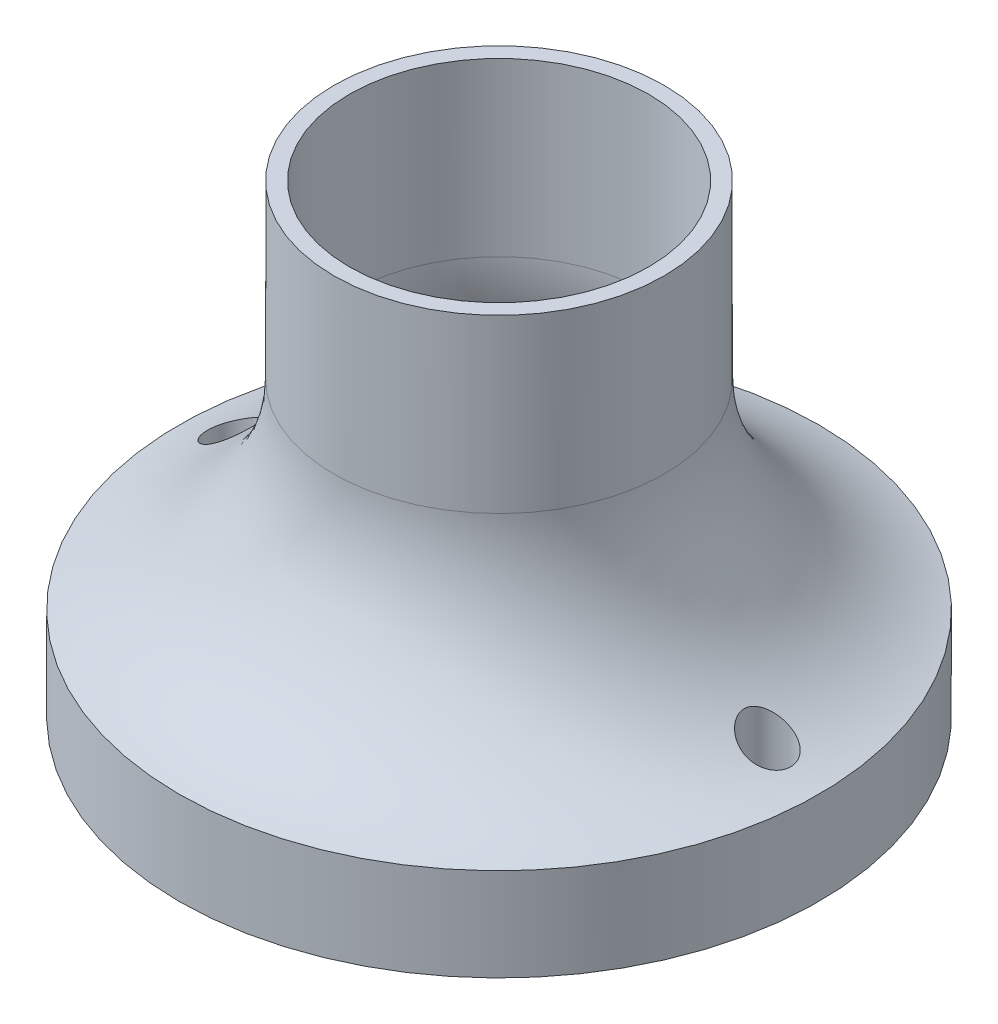
ISO-10303-21;
HEADER;
FILE_DESCRIPTION(('STEP AP214'),'2;1');
FILE_NAME('part.step','',(''),(''),'','','');
FILE_SCHEMA(('AUTOMOTIVE_DESIGN { 1 0 10303 214 1 1 1 1 }'));
ENDSEC;
DATA;
#1=APPLICATION_CONTEXT('core data for automotive mechanical design processes');
#2=APPLICATION_PROTOCOL_DEFINITION('international standard','automotive_design',2000,#1);
#3=PRODUCT_CONTEXT('',#1,'mechanical');
#4=PRODUCT('Part','Part','',(#3));
#5=PRODUCT_RELATED_PRODUCT_CATEGORY('part','',(#4));
#6=PRODUCT_DEFINITION_FORMATION('','',#4);
#7=PRODUCT_DEFINITION_CONTEXT('part definition',#1,'design');
#8=PRODUCT_DEFINITION('design','',#6,#7);
#9=PRODUCT_DEFINITION_SHAPE('','',#8);
#10=(LENGTH_UNIT() NAMED_UNIT(*) SI_UNIT(.MILLI.,.METRE.));
#11=(NAMED_UNIT(*) PLANE_ANGLE_UNIT() SI_UNIT($,.RADIAN.));
#12=(NAMED_UNIT(*) SI_UNIT($,.STERADIAN.) SOLID_ANGLE_UNIT());
#13=UNCERTAINTY_MEASURE_WITH_UNIT(LENGTH_MEASURE(1.E-05),#10,'distance_accuracy_value','');
#14=(GEOMETRIC_REPRESENTATION_CONTEXT(3) GLOBAL_UNCERTAINTY_ASSIGNED_CONTEXT((#13)) GLOBAL_UNIT_ASSIGNED_CONTEXT((#10,
#11,#12)) REPRESENTATION_CONTEXT('',''));
#15=CARTESIAN_POINT('',(0.,0.,0.));
#16=DIRECTION('',(0.,0.,1.));
#17=DIRECTION('',(1.,0.,0.));
#18=AXIS2_PLACEMENT_3D('',#15,#16,#17);
#19=CARTESIAN_POINT('',(0.,9.,0.));
#20=DIRECTION('',(0.,-1.,0.));
#21=DIRECTION('',(0.,0.,-1.));
#22=AXIS2_PLACEMENT_3D('',#19,#20,#21);
#23=CYLINDRICAL_SURFACE('',#22,31.);
#24=CARTESIAN_POINT('',(0.,9.,0.));
#25=DIRECTION('',(0.,1.,0.));
#26=DIRECTION('',(0.,0.,1.));
#27=AXIS2_PLACEMENT_3D('',#24,#25,#26);
#28=CIRCLE('',#27,31.);
#29=CARTESIAN_POINT('',(0.,9.,31.));
#30=VERTEX_POINT('',#29);
#31=EDGE_CURVE('E46',#30,#30,#28,.T.);
#32=ORIENTED_EDGE('',*,*,#31,.F.);
#33=EDGE_LOOP('',(#32));
#34=FACE_BOUND('',#33,.T.);
#35=CARTESIAN_POINT('',(0.,0.,0.));
#36=DIRECTION('',(0.,1.,0.));
#37=DIRECTION('',(0.,0.,1.));
#38=AXIS2_PLACEMENT_3D('',#35,#36,#37);
#39=CIRCLE('',#38,31.);
#40=CARTESIAN_POINT('',(0.,0.,31.));
#41=VERTEX_POINT('',#40);
#42=EDGE_CURVE('E150',#41,#41,#39,.T.);
#43=ORIENTED_EDGE('',*,*,#42,.T.);
#44=EDGE_LOOP('',(#43));
#45=FACE_BOUND('',#44,.T.);
#46=ADVANCED_FACE('F32',(#34,#45),#23,.T.);
#47=CARTESIAN_POINT('',(0.,0.,0.));
#48=DIRECTION('',(0.,1.,0.));
#49=DIRECTION('',(0.,0.,1.));
#50=AXIS2_PLACEMENT_3D('',#47,#48,#49);
#51=PLANE('',#50);
#52=CARTESIAN_POINT('',(0.,0.,0.));
#53=DIRECTION('',(0.,1.,0.));
#54=DIRECTION('',(0.,0.,1.));
#55=AXIS2_PLACEMENT_3D('',#52,#53,#54);
#56=CIRCLE('',#55,29.5);
#57=CARTESIAN_POINT('',(29.4651442307692,0.,-1.43362319316013));
#58=VERTEX_POINT('',#57);
#59=CARTESIAN_POINT('',(-29.4651442307692,0.,-1.43362319316013));
#60=VERTEX_POINT('',#59);
#61=EDGE_CURVE('E96',#58,#60,#56,.T.);
#62=ORIENTED_EDGE('',*,*,#61,.T.);
#63=CARTESIAN_POINT('',(-26.,0.,0.));
#64=DIRECTION('',(0.,1.,0.));
#65=DIRECTION('',(0.,0.,1.));
#66=AXIS2_PLACEMENT_3D('',#63,#64,#65);
#67=CIRCLE('',#66,3.74999999999999);
#68=CARTESIAN_POINT('',(-29.4651442307692,0.,1.43362319316014));
#69=VERTEX_POINT('',#68);
#70=EDGE_CURVE('E85',#60,#69,#67,.F.);
#71=ORIENTED_EDGE('',*,*,#70,.T.);
#72=CARTESIAN_POINT('',(29.4651442307692,0.,1.43362319316014));
#73=VERTEX_POINT('',#72);
#74=EDGE_CURVE('E170',#69,#73,#56,.T.);
#75=ORIENTED_EDGE('',*,*,#74,.T.);
#76=CARTESIAN_POINT('',(26.,0.,0.));
#77=DIRECTION('',(0.,1.,0.));
#78=DIRECTION('',(0.,0.,1.));
#79=AXIS2_PLACEMENT_3D('',#76,#77,#78);
#80=CIRCLE('',#79,3.74999999999999);
#81=EDGE_CURVE('E54',#73,#58,#80,.F.);
#82=ORIENTED_EDGE('',*,*,#81,.T.);
#83=EDGE_LOOP('',(#62,#71,#75,#82));
#84=FACE_BOUND('',#83,.T.);
#85=CARTESIAN_POINT('',(-26.,0.,0.));
#86=DIRECTION('',(0.,-1.,0.));
#87=DIRECTION('',(0.,0.,-1.));
#88=AXIS2_PLACEMENT_3D('',#85,#86,#87);
#89=CIRCLE('',#88,2.24999999999999);
#90=CARTESIAN_POINT('',(-26.,0.,-2.24999999999998));
#91=VERTEX_POINT('',#90);
#92=EDGE_CURVE('E159',#91,#91,#89,.T.);
#93=ORIENTED_EDGE('',*,*,#92,.F.);
#94=EDGE_LOOP('',(#93));
#95=FACE_BOUND('',#94,.T.);
#96=CARTESIAN_POINT('',(26.,0.,0.));
#97=DIRECTION('',(0.,-1.,0.));
#98=DIRECTION('',(0.,0.,-1.));
#99=AXIS2_PLACEMENT_3D('',#96,#97,#98);
#100=CIRCLE('',#99,2.24999999999999);
#101=CARTESIAN_POINT('',(26.,0.,-2.24999999999998));
#102=VERTEX_POINT('',#101);
#103=EDGE_CURVE('E148',#102,#102,#100,.T.);
#104=ORIENTED_EDGE('',*,*,#103,.F.);
#105=EDGE_LOOP('',(#104));
#106=FACE_BOUND('',#105,.T.);
#107=ORIENTED_EDGE('',*,*,#42,.F.);
#108=EDGE_LOOP('',(#107));
#109=FACE_BOUND('',#108,.T.);
#110=ADVANCED_FACE('F177',(#84,#95,#106,#109),#51,.F.);
#111=CARTESIAN_POINT('',(0.,45.,0.));
#112=DIRECTION('',(0.,-1.,0.));
#113=DIRECTION('',(0.,0.,-1.));
#114=AXIS2_PLACEMENT_3D('',#111,#112,#113);
#115=CYLINDRICAL_SURFACE('',#114,16.);
#116=CARTESIAN_POINT('',(0.,28.3649167310371,0.));
#117=DIRECTION('',(0.,-1.,0.));
#118=DIRECTION('',(0.,0.,-1.));
#119=AXIS2_PLACEMENT_3D('',#116,#117,#118);
#120=CIRCLE('',#119,16.);
#121=CARTESIAN_POINT('',(0.,28.3649167310371,-16.));
#122=VERTEX_POINT('',#121);
#123=EDGE_CURVE('E11',#122,#122,#120,.F.);
#124=ORIENTED_EDGE('',*,*,#123,.T.);
#125=EDGE_LOOP('',(#124));
#126=FACE_BOUND('',#125,.T.);
#127=CARTESIAN_POINT('',(0.,45.,0.));
#128=DIRECTION('',(0.,1.,0.));
#129=DIRECTION('',(0.,0.,1.));
#130=AXIS2_PLACEMENT_3D('',#127,#128,#129);
#131=CIRCLE('',#130,16.);
#132=CARTESIAN_POINT('',(0.,45.,16.));
#133=VERTEX_POINT('',#132);
#134=EDGE_CURVE('E147',#133,#133,#131,.T.);
#135=ORIENTED_EDGE('',*,*,#134,.F.);
#136=EDGE_LOOP('',(#135));
#137=FACE_BOUND('',#136,.T.);
#138=ADVANCED_FACE('F180',(#126,#137),#115,.T.);
#139=CARTESIAN_POINT('',(0.,45.,0.));
#140=DIRECTION('',(0.,1.,0.));
#141=DIRECTION('',(0.,0.,1.));
#142=AXIS2_PLACEMENT_3D('',#139,#140,#141);
#143=PLANE('',#142);
#144=CARTESIAN_POINT('',(0.,45.,0.));
#145=DIRECTION('',(0.,1.,0.));
#146=DIRECTION('',(0.,0.,1.));
#147=AXIS2_PLACEMENT_3D('',#144,#145,#146);
#148=CIRCLE('',#147,14.5);
#149=CARTESIAN_POINT('',(0.,45.,14.5));
#150=VERTEX_POINT('',#149);
#151=EDGE_CURVE('E167',#150,#150,#148,.T.);
#152=ORIENTED_EDGE('',*,*,#151,.F.);
#153=EDGE_LOOP('',(#152));
#154=FACE_BOUND('',#153,.T.);
#155=ORIENTED_EDGE('',*,*,#134,.T.);
#156=EDGE_LOOP('',(#155));
#157=FACE_BOUND('',#156,.T.);
#158=ADVANCED_FACE('F140',(#154,#157),#143,.T.);
#159=CARTESIAN_POINT('',(0.,28.3649167310371,0.));
#160=DIRECTION('',(0.,-1.,0.));
#161=DIRECTION('',(0.,0.,-1.));
#162=AXIS2_PLACEMENT_3D('',#159,#160,#161);
#163=TOROIDAL_SURFACE('',#162,36.,20.);
#164=CARTESIAN_POINT('',(-27.7003388781536,10.1505208423609,-1.47354935451997));
#165=CARTESIAN_POINT('',(-27.6145280113506,10.1869979171845,-1.57255781009781));
#166=CARTESIAN_POINT('',(-27.5207677249025,10.2276572255752,-1.66321166990088));
#167=CARTESIAN_POINT('',(-27.321286746106,10.316583238924,-1.82573178906202));
#168=CARTESIAN_POINT('',(-27.2155538676829,10.3648577148357,-1.89757865531187));
#169=CARTESIAN_POINT('',(-26.9965394310572,10.4678647584349,-2.02117669612327));
#170=CARTESIAN_POINT('',(-26.8832903857396,10.5225702108218,-2.07300855887761));
#171=CARTESIAN_POINT('',(-26.6524460145523,10.6375535736855,-2.15682757379206));
#172=CARTESIAN_POINT('',(-26.5348507316348,10.6978314291012,-2.18881492201253));
#173=CARTESIAN_POINT('',(-26.2885658781924,10.8280614219735,-2.23521997799569));
#174=CARTESIAN_POINT('',(-26.1597662998369,10.8984012425765,-2.24795713490262));
#175=CARTESIAN_POINT('',(-25.9039947923444,11.0428297943164,-2.25159112472561));
#176=CARTESIAN_POINT('',(-25.7770236208023,11.1169200250964,-2.24247915240704));
#177=CARTESIAN_POINT('',(-25.5141059786491,11.2754082642144,-2.20135812982604));
#178=CARTESIAN_POINT('',(-25.3786773187711,11.3600534212965,-2.16697551655618));
#179=CARTESIAN_POINT('',(-25.1164387469946,11.5296485227744,-2.07393528116125));
#180=CARTESIAN_POINT('',(-24.9896385682108,11.6145987011855,-2.01525075765092));
#181=CARTESIAN_POINT('',(-24.7402776097936,11.7870058416868,-1.87020873314592));
#182=CARTESIAN_POINT('',(-24.6184549698291,11.8742965379424,-1.78237354702527));
#183=CARTESIAN_POINT('',(-24.392033380238,12.0413726930665,-1.58108007722939));
#184=CARTESIAN_POINT('',(-24.2874062610656,12.1211703331595,-1.46766443730309));
#185=CARTESIAN_POINT('',(-24.1293295557718,12.2446056868756,-1.25493233930701));
#186=CARTESIAN_POINT('',(-24.070037270408,12.2918159922106,-1.16200979546713));
#187=CARTESIAN_POINT('',(-23.9644791336079,12.3769840084361,-0.965180835822662));
#188=CARTESIAN_POINT('',(-23.9181930323714,12.4149560901424,-0.861291844962156));
#189=CARTESIAN_POINT('',(-23.8469096561323,12.4739627713598,-0.660528746009364));
#190=CARTESIAN_POINT('',(-23.8197680026929,12.496677993327,-0.564915671611804));
#191=CARTESIAN_POINT('',(-23.778228078965,12.5315890993748,-0.369087287029019));
#192=CARTESIAN_POINT('',(-23.7638225393952,12.5437909839607,-0.268874636509021));
#193=CARTESIAN_POINT('',(-23.7486818689145,12.556618219931,-0.0663616739837972));
#194=CARTESIAN_POINT('',(-23.7479877191187,12.5572088671894,0.0359439818166512));
#195=CARTESIAN_POINT('',(-23.7604250225286,12.5466677140601,0.239090382373329));
#196=CARTESIAN_POINT('',(-23.77355803005,12.5355345957997,0.339930961147767));
#197=CARTESIAN_POINT('',(-23.8118783310906,12.5032945151121,0.532792736039895));
#198=CARTESIAN_POINT('',(-23.8365041190423,12.482652674895,0.625006715421956));
#199=CARTESIAN_POINT('',(-23.8962776430542,12.4330488353467,0.803575983179699));
#200=CARTESIAN_POINT('',(-23.9314313566626,12.404082109688,0.889927908938683));
#201=CARTESIAN_POINT('',(-24.025457265307,12.3275687462166,1.08602313228881));
#202=CARTESIAN_POINT('',(-24.0882997286812,12.2771042593236,1.19272818593936));
#203=CARTESIAN_POINT('',(-24.2277977083312,12.1674455687253,1.39162125638029));
#204=CARTESIAN_POINT('',(-24.3044734571009,12.1082386016512,1.48378763387359));
#205=CARTESIAN_POINT('',(-24.4701391313848,11.9833468142788,1.65418598920068));
#206=CARTESIAN_POINT('',(-24.5592839315622,11.9175840929665,1.73220886113827));
#207=CARTESIAN_POINT('',(-24.7469126871224,11.7827717530259,1.87243028099285));
#208=CARTESIAN_POINT('',(-24.8453957892179,11.7137224349969,1.93463027281622));
#209=CARTESIAN_POINT('',(-25.0712960060402,11.5597151288795,2.05415443121166));
#210=CARTESIAN_POINT('',(-25.2004705536449,11.4744355603986,2.10777322984572));
#211=CARTESIAN_POINT('',(-25.4670373924167,11.3046098821219,2.19041998885617));
#212=CARTESIAN_POINT('',(-25.6044360046849,11.2200643952112,2.21942876699608));
#213=CARTESIAN_POINT('',(-25.8921378943654,11.0493748074854,2.25232979338633));
#214=CARTESIAN_POINT('',(-26.0427306246333,10.9634134105324,2.2546992056579));
#215=CARTESIAN_POINT('',(-26.3446565802304,10.7975772385191,2.22859547435202));
#216=CARTESIAN_POINT('',(-26.4959894814388,10.71770001583,2.20013480443427));
#217=CARTESIAN_POINT('',(-26.7832910215065,10.5715647356281,2.11420798909702));
#218=CARTESIAN_POINT('',(-26.9196030229081,10.5047490743314,2.05885608770323));
#219=CARTESIAN_POINT('',(-27.1818846303462,10.3802361045323,1.92030836495427));
#220=CARTESIAN_POINT('',(-27.3078631130065,10.3225309297467,1.83713675970152));
#221=CARTESIAN_POINT('',(-27.5292468268119,10.2239108760453,1.65587347180838));
#222=CARTESIAN_POINT('',(-27.6265051169588,10.1818198548431,1.56068291512087));
#223=CARTESIAN_POINT('',(-27.8035504715928,10.1067496697064,1.35217113411658));
#224=CARTESIAN_POINT('',(-27.8833494148056,10.0737643065786,1.23886232823422));
#225=CARTESIAN_POINT('',(-28.0146998330726,10.0202833159009,1.0095579491806));
#226=CARTESIAN_POINT('',(-28.0682554971013,9.99887937389205,0.89491849975078));
#227=CARTESIAN_POINT('',(-28.1556020948341,9.96427481784398,0.657185575114));
#228=CARTESIAN_POINT('',(-28.1894009464055,9.95107091737078,0.534095508761796));
#229=CARTESIAN_POINT('',(-28.2344012126702,9.93354944072189,0.290541144399554));
#230=CARTESIAN_POINT('',(-28.2467790740502,9.9287689502608,0.170326006380059));
#231=CARTESIAN_POINT('',(-28.2521157859503,9.92670393451121,-0.0706011847298375));
#232=CARTESIAN_POINT('',(-28.245076343437,9.92941875031363,-0.191313193209069));
#233=CARTESIAN_POINT('',(-28.212198351696,9.94218585854686,-0.427320385842524));
#234=CARTESIAN_POINT('',(-28.1867293007291,9.95209394463325,-0.542675306193086));
#235=CARTESIAN_POINT('',(-28.1184102645373,9.97897153463926,-0.767200005134629));
#236=CARTESIAN_POINT('',(-28.0755677032131,9.99593802250272,-0.876372402908524));
#237=CARTESIAN_POINT('',(-27.9814309652773,10.0337941623369,-1.0706858015214));
#238=CARTESIAN_POINT('',(-27.9322272477238,10.0537733999213,-1.1570288070032));
#239=CARTESIAN_POINT('',(-27.823595593368,10.0985703183493,-1.32163913929131));
#240=CARTESIAN_POINT('',(-27.7641662866166,10.1233886475581,-1.39990538178202));
#241=CARTESIAN_POINT('',(-27.7003388781536,10.1505208423609,-1.47354935451997));
#242=B_SPLINE_CURVE_WITH_KNOTS('',3,(#164,#165,#166,#167,#168,#169,#170,#171,#172,#173,#174,
#175,#176,#177,#178,#179,#180,#181,#182,#183,#184,#185,#186,#187,#188,#189,#190,#191,#192,#193,
#194,#195,#196,#197,#198,#199,#200,#201,#202,#203,#204,#205,#206,#207,#208,#209,#210,#211,#212,
#213,#214,#215,#216,#217,#218,#219,#220,#221,#222,#223,#224,#225,#226,#227,#228,#229,#230,#231,
#232,#233,#234,#235,#236,#237,#238,#239,#240,#241),.UNSPECIFIED.,.T.,.F.,(4,2,2,2,2,2,2,2,2,2,2,
2,2,2,2,2,2,2,2,2,2,2,2,2,2,2,2,2,2,2,2,2,2,2,2,2,2,2,4),(0.,0.407607153852534,
0.815632976693361,1.22199627601757,1.6283555604789,2.06847658218988,2.50877500319684,
2.99677211151394,3.48531086613481,4.0038411888037,4.52151340502439,4.87995254146318,
5.23783047915992,5.54238741803491,5.84677041515515,6.15206302637119,6.45738995930614,
6.74915101438727,7.0410780407176,7.44008549016675,7.83968132811339,8.24477361525316,
8.64982892269459,9.13913805023111,9.6288282193977,10.146378077022,10.6637186153724,
11.1457184385261,11.6272997844576,12.0522991105771,12.4770083766716,12.8600176781252,
13.2428733768815,13.6039429523714,13.9649807874043,14.3189738620232,14.6728158304569,
14.975959494198,15.2791438025575),.UNSPECIFIED.);
#243=CARTESIAN_POINT('',(-27.7003388781536,10.1505208423609,-1.47354935451997));
#244=VERTEX_POINT('',#243);
#245=EDGE_CURVE('E37',#244,#244,#242,.T.);
#246=ORIENTED_EDGE('',*,*,#245,.T.);
#247=EDGE_LOOP('',(#246));
#248=FACE_BOUND('',#247,.T.);
#249=CARTESIAN_POINT('',(25.5382730650221,11.2615216169001,-2.20211450103872));
#250=CARTESIAN_POINT('',(25.6995988617188,11.1623416314085,-2.2359351517598));
#251=CARTESIAN_POINT('',(25.865561041976,11.0645123111773,-2.25223559635372));
#252=CARTESIAN_POINT('',(26.200654890385,10.8753326481738,-2.24727721196971));
#253=CARTESIAN_POINT('',(26.3697846351676,10.7839785251803,-2.22604048820175));
#254=CARTESIAN_POINT('',(26.6789702952827,10.6237887839815,-2.15011583964656));
#255=CARTESIAN_POINT('',(26.8196502420754,10.5536159895838,-2.10079470348944));
#256=CARTESIAN_POINT('',(27.0917472143208,10.4223441046463,-1.97309286565213));
#257=CARTESIAN_POINT('',(27.2231751706006,10.36123420885,-1.89474716499451));
#258=CARTESIAN_POINT('',(27.4551383353925,10.2565063164984,-1.72146348379159));
#259=CARTESIAN_POINT('',(27.5574870857485,10.211665817626,-1.62968939425664));
#260=CARTESIAN_POINT('',(27.7452377064373,10.1311876505097,-1.42678062926138));
#261=CARTESIAN_POINT('',(27.8306510076076,10.09554376994,-1.31565910843952));
#262=CARTESIAN_POINT('',(27.9725117469294,10.0373166352031,-1.08978410889102));
#263=CARTESIAN_POINT('',(28.0310345208733,10.0137672871476,-0.976578958230296));
#264=CARTESIAN_POINT('',(28.12841333049,9.97497434485159,-0.740684443425492));
#265=CARTESIAN_POINT('',(28.1672777887585,9.95972719332467,-0.617999167053547));
#266=CARTESIAN_POINT('',(28.2218378038364,9.93842062158702,-0.374837922668288));
#267=CARTESIAN_POINT('',(28.2388142714722,9.93185262411457,-0.254692227032232));
#268=CARTESIAN_POINT('',(28.253212473044,9.92627831870842,-0.0130683560480444));
#269=CARTESIAN_POINT('',(28.2506378984267,9.92727058331623,0.108409563436958));
#270=CARTESIAN_POINT('',(28.2263388833243,9.93669040352149,0.34621861719116));
#271=CARTESIAN_POINT('',(28.2050680672256,9.94494183513306,0.462603549503671));
#272=CARTESIAN_POINT('',(28.1448349561439,9.96854730839053,0.689934383623232));
#273=CARTESIAN_POINT('',(28.1058729912604,9.98390121751136,0.800880386872508));
#274=CARTESIAN_POINT('',(28.011353362449,10.0216902759888,1.01528263496143));
#275=CARTESIAN_POINT('',(27.9556596577972,10.0441835615863,1.11866849754893));
#276=CARTESIAN_POINT('',(27.8298761731491,10.0959227870772,1.31437866069182));
#277=CARTESIAN_POINT('',(27.7597846686413,10.1251695359258,1.40670163407869));
#278=CARTESIAN_POINT('',(27.6046800736501,10.1912890682909,1.58167533539606));
#279=CARTESIAN_POINT('',(27.5191913016979,10.2284149800489,1.66380779971892));
#280=CARTESIAN_POINT('',(27.3382711578091,10.3089613119838,1.81252767015844));
#281=CARTESIAN_POINT('',(27.2428372936489,10.3523833110221,1.87911116611547));
#282=CARTESIAN_POINT('',(27.0379681302836,10.4481171486565,2.00006299733634));
#283=CARTESIAN_POINT('',(26.9280199447584,10.5008405093252,2.05323447226118));
#284=CARTESIAN_POINT('',(26.7034776620662,10.6117779548697,2.14059618401917));
#285=CARTESIAN_POINT('',(26.5888817595829,10.6699941852198,2.17477896780539));
#286=CARTESIAN_POINT('',(26.3465888322605,10.7968796288836,2.22692874130864));
#287=CARTESIAN_POINT('',(26.2187181315504,10.8660130899734,2.24295490866205));
#288=CARTESIAN_POINT('',(25.9643184268715,11.0082071873288,2.25332106546582));
#289=CARTESIAN_POINT('',(25.8377899450425,11.0812692893175,2.24765290492385));
#290=CARTESIAN_POINT('',(25.5753166037412,11.237832548054,2.21393209276981));
#291=CARTESIAN_POINT('',(25.4398358403993,11.3216073616286,2.18352185703187));
#292=CARTESIAN_POINT('',(25.1769265922545,11.4898382366238,2.09861007455017));
#293=CARTESIAN_POINT('',(25.0495066827066,11.5742949192336,2.04408334905755));
#294=CARTESIAN_POINT('',(24.7973984792396,11.7467896997691,1.90740670669952));
#295=CARTESIAN_POINT('',(24.6734848803997,11.8346809025517,1.8236307906612));
#296=CARTESIAN_POINT('',(24.4421572059421,12.0037655651675,1.63042183651534));
#297=CARTESIAN_POINT('',(24.334720569415,12.0849681115119,1.52102440891925));
#298=CARTESIAN_POINT('',(24.169457485115,12.2129773338014,1.31292549058795));
#299=CARTESIAN_POINT('',(24.1062919706685,12.2629172373537,1.22037395668456));
#300=CARTESIAN_POINT('',(23.9930841145861,12.3537095590972,1.023536293008));
#301=CARTESIAN_POINT('',(23.9430212954518,12.3945761421439,0.919268842419943));
#302=CARTESIAN_POINT('',(23.8653823470636,12.458589441485,0.718065860464562));
#303=CARTESIAN_POINT('',(23.8354979598701,12.4835193980192,0.622594704345676));
#304=CARTESIAN_POINT('',(23.7884915537241,12.5229281976303,0.426467853651723));
#305=CARTESIAN_POINT('',(23.7713615274987,12.5374135976886,0.325815454408102));
#306=CARTESIAN_POINT('',(23.7509476146391,12.554692293761,0.121716313353122));
#307=CARTESIAN_POINT('',(23.7477149523091,12.5574423341297,0.018260645774243));
#308=CARTESIAN_POINT('',(23.7554771234714,12.5508603118126,-0.187725960267434));
#309=CARTESIAN_POINT('',(23.7664730981627,12.5415272800114,-0.290256823892721));
#310=CARTESIAN_POINT('',(23.8008766037866,12.5125337588877,-0.485400362889773));
#311=CARTESIAN_POINT('',(23.823530925676,12.4935006142519,-0.578243899195785));
#312=CARTESIAN_POINT('',(23.8795489515668,12.4468839420876,-0.758347834991529));
#313=CARTESIAN_POINT('',(23.9129157885648,12.4192979132521,-0.845606592184055));
#314=CARTESIAN_POINT('',(23.9929742689239,12.353903664237,-1.02210819237502));
#315=CARTESIAN_POINT('',(24.0406992530326,12.3153247743533,-1.11059187169567));
#316=CARTESIAN_POINT('',(24.1457506244159,12.2317509952172,-1.27830651026886));
#317=CARTESIAN_POINT('',(24.2030824669991,12.1867524627045,-1.35753216866777));
#318=CARTESIAN_POINT('',(24.3388328325084,12.0821073972052,-1.52206241739934));
#319=CARTESIAN_POINT('',(24.4191469347568,12.0213752416978,-1.60511161417383));
#320=CARTESIAN_POINT('',(24.5895080958552,11.8956468541171,-1.7567115966282));
#321=CARTESIAN_POINT('',(24.6795621401261,11.8306475749991,-1.82525187102218));
#322=CARTESIAN_POINT('',(24.8905796581344,11.6822704559842,-1.96242921115612));
#323=CARTESIAN_POINT('',(25.0137366811573,11.5982646046754,-2.02704297378727));
#324=CARTESIAN_POINT('',(25.2695811559225,11.4296934772265,-2.13264480385773));
#325=CARTESIAN_POINT('',(25.4022797958534,11.3451276534998,-2.1736046101772));
#326=CARTESIAN_POINT('',(25.5382730650221,11.2615216169001,-2.20211450103872));
#327=B_SPLINE_CURVE_WITH_KNOTS('',3,(#249,#250,#251,#252,#253,#254,#255,#256,#257,#258,#259,
#260,#261,#262,#263,#264,#265,#266,#267,#268,#269,#270,#271,#272,#273,#274,#275,#276,#277,#278,
#279,#280,#281,#282,#283,#284,#285,#286,#287,#288,#289,#290,#291,#292,#293,#294,#295,#296,#297,
#298,#299,#300,#301,#302,#303,#304,#305,#306,#307,#308,#309,#310,#311,#312,#313,#314,#315,#316,
#317,#318,#319,#320,#321,#322,#323,#324,#325,#326),.UNSPECIFIED.,.T.,.F.,(4,2,2,2,2,2,2,2,2,2,2,
2,2,2,2,2,2,2,2,2,2,2,2,2,2,2,2,2,2,2,2,2,2,2,2,2,2,2,4),(0.,0.576390826455977,1.15244233601116,
1.64395131766808,2.13486950274239,2.56626009431747,2.9973585136004,3.38412946079967,
3.77073455551333,4.13349995365454,4.49619685949974,4.85032934518441,5.2044552233799,
5.56154212065871,5.91867181336154,6.2897427429432,6.66090688693077,7.05831974050171,
7.45588846830333,7.89282399478806,8.32992368264565,8.8143576506717,9.29929858884643,
9.81720960122171,10.3344050133563,10.7011103188736,11.0672390511733,11.3752361149544,
11.6830396527038,11.9919767562476,12.3009386394365,12.5920631812552,12.8832729434303,
13.2051569504863,13.5272243644882,13.9173755172665,14.3078083629367,14.7931115555976,
15.2789933823952),.UNSPECIFIED.);
#328=CARTESIAN_POINT('',(25.5382730650221,11.2615216169001,-2.20211450103872));
#329=VERTEX_POINT('',#328);
#330=EDGE_CURVE('E142',#329,#329,#327,.T.);
#331=ORIENTED_EDGE('',*,*,#330,.T.);
#332=EDGE_LOOP('',(#331));
#333=FACE_BOUND('',#332,.T.);
#334=ORIENTED_EDGE('',*,*,#31,.T.);
#335=EDGE_LOOP('',(#334));
#336=FACE_BOUND('',#335,.T.);
#337=ORIENTED_EDGE('',*,*,#123,.F.);
#338=EDGE_LOOP('',(#337));
#339=FACE_BOUND('',#338,.T.);
#340=ADVANCED_FACE('F34',(#248,#333,#336,#339),#163,.F.);
#341=CARTESIAN_POINT('',(26.,0.,0.));
#342=DIRECTION('',(0.,-1.,0.));
#343=DIRECTION('',(0.,0.,-1.));
#344=AXIS2_PLACEMENT_3D('',#341,#342,#343);
#345=CYLINDRICAL_SURFACE('',#344,2.24999999999999);
#346=ORIENTED_EDGE('',*,*,#103,.T.);
#347=EDGE_LOOP('',(#346));
#348=FACE_BOUND('',#347,.T.);
#349=ORIENTED_EDGE('',*,*,#330,.F.);
#350=EDGE_LOOP('',(#349));
#351=FACE_BOUND('',#350,.T.);
#352=ADVANCED_FACE('F134',(#348,#351),#345,.F.);
#353=CARTESIAN_POINT('',(-26.,0.,0.));
#354=DIRECTION('',(0.,-1.,0.));
#355=DIRECTION('',(0.,0.,-1.));
#356=AXIS2_PLACEMENT_3D('',#353,#354,#355);
#357=CYLINDRICAL_SURFACE('',#356,2.24999999999999);
#358=ORIENTED_EDGE('',*,*,#92,.T.);
#359=EDGE_LOOP('',(#358));
#360=FACE_BOUND('',#359,.T.);
#361=ORIENTED_EDGE('',*,*,#245,.F.);
#362=EDGE_LOOP('',(#361));
#363=FACE_BOUND('',#362,.T.);
#364=ADVANCED_FACE('F130',(#360,#363),#357,.F.);
#365=CARTESIAN_POINT('',(0.,9.,0.));
#366=DIRECTION('',(0.,-1.,0.));
#367=DIRECTION('',(0.,0.,-1.));
#368=AXIS2_PLACEMENT_3D('',#365,#366,#367);
#369=CYLINDRICAL_SURFACE('',#368,29.5);
#370=DIRECTION('',(0.,-1.,0.));
#371=VECTOR('',#370,1.);
#372=CARTESIAN_POINT('',(-29.4651442307692,9.,1.43362319316015));
#373=LINE('',#372,#371);
#374=CARTESIAN_POINT('',(-29.4651442307692,7.87101519911789,1.43362319316014));
#375=VERTEX_POINT('',#374);
#376=EDGE_CURVE('E88',#69,#375,#373,.F.);
#377=ORIENTED_EDGE('',*,*,#376,.T.);
#378=CARTESIAN_POINT('',(0.,7.87101519911788,0.));
#379=DIRECTION('',(0.,1.,0.));
#380=DIRECTION('',(0.,0.,1.));
#381=AXIS2_PLACEMENT_3D('',#378,#379,#380);
#382=CIRCLE('',#381,29.5);
#383=CARTESIAN_POINT('',(29.4651442307692,7.87101519911788,1.43362319316014));
#384=VERTEX_POINT('',#383);
#385=EDGE_CURVE('E95',#375,#384,#382,.T.);
#386=ORIENTED_EDGE('',*,*,#385,.T.);
#387=DIRECTION('',(0.,-1.,0.));
#388=VECTOR('',#387,1.);
#389=CARTESIAN_POINT('',(29.4651442307692,0.,1.43362319316017));
#390=LINE('',#389,#388);
#391=EDGE_CURVE('E164',#73,#384,#390,.F.);
#392=ORIENTED_EDGE('',*,*,#391,.F.);
#393=ORIENTED_EDGE('',*,*,#74,.F.);
#394=EDGE_LOOP('',(#377,#386,#392,#393));
#395=FACE_BOUND('',#394,.T.);
#396=ADVANCED_FACE('F127',(#395),#369,.F.);
#397=ORIENTED_EDGE('',*,*,#61,.F.);
#398=DIRECTION('',(0.,-1.,0.));
#399=VECTOR('',#398,1.);
#400=CARTESIAN_POINT('',(29.4651442307692,9.,-1.43362319316013));
#401=LINE('',#400,#399);
#402=CARTESIAN_POINT('',(29.4651442307692,7.87101519911788,-1.43362319316013));
#403=VERTEX_POINT('',#402);
#404=EDGE_CURVE('E59',#58,#403,#401,.F.);
#405=ORIENTED_EDGE('',*,*,#404,.T.);
#406=CARTESIAN_POINT('',(-29.4651442307692,7.87101519911789,-1.43362319316013));
#407=VERTEX_POINT('',#406);
#408=EDGE_CURVE('E91',#403,#407,#382,.T.);
#409=ORIENTED_EDGE('',*,*,#408,.T.);
#410=DIRECTION('',(0.,-1.,0.));
#411=VECTOR('',#410,1.);
#412=CARTESIAN_POINT('',(-29.4651442307692,0.,-1.43362319316015));
#413=LINE('',#412,#411);
#414=EDGE_CURVE('E79',#60,#407,#413,.F.);
#415=ORIENTED_EDGE('',*,*,#414,.F.);
#416=EDGE_LOOP('',(#397,#405,#409,#415));
#417=FACE_BOUND('',#416,.T.);
#418=ADVANCED_FACE('F92',(#417),#369,.F.);
#419=CARTESIAN_POINT('',(0.,45.,0.));
#420=DIRECTION('',(0.,-1.,0.));
#421=DIRECTION('',(0.,0.,-1.));
#422=AXIS2_PLACEMENT_3D('',#419,#420,#421);
#423=CYLINDRICAL_SURFACE('',#422,14.5);
#424=CARTESIAN_POINT('',(0.,28.3649167310371,0.));
#425=DIRECTION('',(0.,-1.,0.));
#426=DIRECTION('',(0.,0.,-1.));
#427=AXIS2_PLACEMENT_3D('',#424,#425,#426);
#428=CIRCLE('',#427,14.5);
#429=CARTESIAN_POINT('',(0.,28.3649167310371,-14.5));
#430=VERTEX_POINT('',#429);
#431=EDGE_CURVE('E165',#430,#430,#428,.F.);
#432=ORIENTED_EDGE('',*,*,#431,.F.);
#433=EDGE_LOOP('',(#432));
#434=FACE_BOUND('',#433,.T.);
#435=ORIENTED_EDGE('',*,*,#151,.T.);
#436=EDGE_LOOP('',(#435));
#437=FACE_BOUND('',#436,.T.);
#438=ADVANCED_FACE('F126',(#434,#437),#423,.F.);
#439=CARTESIAN_POINT('',(0.,28.3649167310371,0.));
#440=DIRECTION('',(0.,-1.,0.));
#441=DIRECTION('',(0.,0.,-1.));
#442=AXIS2_PLACEMENT_3D('',#439,#440,#441);
#443=TOROIDAL_SURFACE('',#442,36.,21.5);
#444=CARTESIAN_POINT('',(-22.4688093736474,11.6283004731701,1.26221739821637));
#445=CARTESIAN_POINT('',(-22.5421107969535,11.5600148361157,1.46726200470735));
#446=CARTESIAN_POINT('',(-22.6318494390311,11.4778642331909,1.66183923864881));
#447=CARTESIAN_POINT('',(-22.8379405167637,11.2953570609095,2.02684044910545));
#448=CARTESIAN_POINT('',(-22.9543544696379,11.1949585215423,2.19720709767945));
#449=CARTESIAN_POINT('',(-23.2078457034841,10.9845113691876,2.51130625645366));
#450=CARTESIAN_POINT('',(-23.3447092500436,10.8745669962362,2.65528347341082));
#451=CARTESIAN_POINT('',(-23.6366725755405,10.6495225924435,2.91817789705554));
#452=CARTESIAN_POINT('',(-23.7917635000777,10.5344250815506,3.0371071936372));
#453=CARTESIAN_POINT('',(-24.1504153877535,10.2797954945589,3.27047563422127));
#454=CARTESIAN_POINT('',(-24.3574689196707,10.1399769019923,3.37926802354472));
#455=CARTESIAN_POINT('',(-24.790479369367,9.86373090755668,3.55728738347413));
#456=CARTESIAN_POINT('',(-25.0164501080879,9.7273060812521,3.62648513183151));
#457=CARTESIAN_POINT('',(-25.3698733857028,9.52610688338807,3.69874311897319));
#458=CARTESIAN_POINT('',(-25.4925809978893,9.45835754923804,3.71760627077267));
#459=CARTESIAN_POINT('',(-25.7406722818367,9.3255434336003,3.74309741470614));
#460=CARTESIAN_POINT('',(-25.8660547620742,9.26047749317259,3.7497307440849));
#461=CARTESIAN_POINT('',(-26.1184085959466,9.13353917567663,3.75025316336951));
#462=CARTESIAN_POINT('',(-26.2453794554249,9.07166583462726,3.74414612348165));
#463=CARTESIAN_POINT('',(-26.4997153887266,8.95153237654801,3.71875101338443));
#464=CARTESIAN_POINT('',(-26.6270804072995,8.89327177523039,3.69946471403909));
#465=CARTESIAN_POINT('',(-26.868848515183,8.78605079359772,3.64984444255829));
#466=CARTESIAN_POINT('',(-26.9833418868664,8.73673139819501,3.62072301908798));
#467=CARTESIAN_POINT('',(-27.2103713436993,8.64160589583165,3.55127964847392));
#468=CARTESIAN_POINT('',(-27.3229076875741,8.59579932169232,3.51095919402462));
#469=CARTESIAN_POINT('',(-27.5447624073845,8.50790537176741,3.41915395445709));
#470=CARTESIAN_POINT('',(-27.6540824790369,8.46581601183923,3.36767517664611));
#471=CARTESIAN_POINT('',(-27.8683046872872,8.38546477340502,3.25371354865719));
#472=CARTESIAN_POINT('',(-27.9732072980456,8.34720248350026,3.19123188325485));
#473=CARTESIAN_POINT('',(-28.1661248837698,8.2785685431054,3.06305533189446));
#474=CARTESIAN_POINT('',(-28.2547304465186,8.24779170677074,2.99846368095482));
#475=CARTESIAN_POINT('',(-28.4265438989305,8.18935859503829,2.86120102816327));
#476=CARTESIAN_POINT('',(-28.5097523312953,8.16170200568065,2.78853084063878));
#477=CARTESIAN_POINT('',(-28.6698957344735,8.10951222709937,2.63560465876433));
#478=CARTESIAN_POINT('',(-28.7468326288372,8.08497807888276,2.55535100677705));
#479=CARTESIAN_POINT('',(-28.8936553298018,8.03899657368523,2.38781554803265));
#480=CARTESIAN_POINT('',(-28.9635414097775,8.01754909701386,2.3005340139973));
#481=CARTESIAN_POINT('',(-29.0911041926241,7.97903088580372,2.12567457077594));
#482=CARTESIAN_POINT('',(-29.1492849157131,7.96176334000942,2.03850710930046));
#483=CARTESIAN_POINT('',(-29.2583442768632,7.92982658108426,1.85922147680738));
#484=CARTESIAN_POINT('',(-29.3092204834052,7.91515823279252,1.76710167121962));
#485=CARTESIAN_POINT('',(-29.4031471661987,7.88838630986853,1.57865990712979));
#486=CARTESIAN_POINT('',(-29.4462017588002,7.87628138560139,1.48234019224268));
#487=CARTESIAN_POINT('',(-29.5241326927315,7.85457471420351,1.28613188365519));
#488=CARTESIAN_POINT('',(-29.5590060557062,7.8449738785379,1.18624200544892));
#489=CARTESIAN_POINT('',(-29.6193237534883,7.82848584442454,0.986680204267444));
#490=CARTESIAN_POINT('',(-29.6450164552722,7.82152678592082,0.887089212046806));
#491=CARTESIAN_POINT('',(-29.6881606527126,7.80989618162763,0.685969434496511));
#492=CARTESIAN_POINT('',(-29.7056091600496,7.80522546528382,0.584439960367001));
#493=CARTESIAN_POINT('',(-29.7320904729761,7.79815391942528,0.380248681616952));
#494=CARTESIAN_POINT('',(-29.7411269134593,7.79575210949881,0.277587385483803));
#495=CARTESIAN_POINT('',(-29.7507291038665,7.79320140420324,0.0718313176699684));
#496=CARTESIAN_POINT('',(-29.7512917371701,7.79305333774859,-0.0312635995501809));
#497=CARTESIAN_POINT('',(-29.7402848365413,7.79597284545069,-0.33799765195404));
#498=CARTESIAN_POINT('',(-29.7163058955561,7.80232852808682,-0.541314545111899));
#499=CARTESIAN_POINT('',(-29.635795635212,7.82399724965571,-0.940779607723238));
#500=CARTESIAN_POINT('',(-29.5792651958002,7.83931004645579,-1.13692797080732));
#501=CARTESIAN_POINT('',(-29.4355530883031,7.8791803804126,-1.5168098500403));
#502=CARTESIAN_POINT('',(-29.3483530866524,7.90374344779285,-1.70053586189755));
#503=CARTESIAN_POINT('',(-29.1463072781873,7.96245828701516,-2.05038225844537));
#504=CARTESIAN_POINT('',(-29.0314613266903,7.99661010903927,-2.21650255099143));
#505=CARTESIAN_POINT('',(-28.776651852799,8.07524869502585,-2.52858186009798));
#506=CARTESIAN_POINT('',(-28.6364244336566,8.11984564730501,-2.6742974196459));
#507=CARTESIAN_POINT('',(-28.336561523793,8.21931962898242,-2.93991763412963));
#508=CARTESIAN_POINT('',(-28.1769245669766,8.27419743511222,-3.05982033739944));
#509=CARTESIAN_POINT('',(-27.8385937137161,8.39589694086472,-3.2746604338394));
#510=CARTESIAN_POINT('',(-27.6594766512235,8.46302314700067,-3.36875730285379));
#511=CARTESIAN_POINT('',(-27.2920982022954,8.60755620048178,-3.52603826356635));
#512=CARTESIAN_POINT('',(-27.1038347748054,8.68496534925995,-3.58921542023006));
#513=CARTESIAN_POINT('',(-26.7122741955495,8.85408827015523,-3.68758919940114));
#514=CARTESIAN_POINT('',(-26.5087516992076,8.94638093294828,-3.72088460076013));
#515=CARTESIAN_POINT('',(-26.1033384255563,9.13998794649291,-3.75409671833462));
#516=CARTESIAN_POINT('',(-25.9014481948482,9.24130519309471,-3.75400268153653));
#517=CARTESIAN_POINT('',(-25.4850964984879,9.46104250930967,-3.72089067922256));
#518=CARTESIAN_POINT('',(-25.2712606134028,9.58017314249122,-3.68474861292186));
#519=CARTESIAN_POINT('',(-24.855840387303,9.8241075229505,-3.57763731983848));
#520=CARTESIAN_POINT('',(-24.6542649840788,9.94891529566511,-3.50664302010481));
#521=CARTESIAN_POINT('',(-24.246182267685,10.2143631963796,-3.32294724500836));
#522=CARTESIAN_POINT('',(-24.0414901087662,10.3552584329771,-3.20657177914838));
#523=CARTESIAN_POINT('',(-23.6559262504748,10.6341480049527,-2.93653606786603));
#524=CARTESIAN_POINT('',(-23.475056985086,10.7721420427071,-2.78287201722273));
#525=CARTESIAN_POINT('',(-23.1706006867118,11.0146380635151,-2.46905255098189));
#526=CARTESIAN_POINT('',(-23.0425121352625,11.1208177293237,-2.31456191864419));
#527=CARTESIAN_POINT('',(-22.8096785473699,11.319766099032,-1.98130131087971));
#528=CARTESIAN_POINT('',(-22.7048945338196,11.4125571028978,-1.80257269230944));
#529=CARTESIAN_POINT('',(-22.5449706745857,11.5574424276983,-1.46670317411714));
#530=CARTESIAN_POINT('',(-22.4839513309435,11.6139772919757,-1.31433330812307));
#531=CARTESIAN_POINT('',(-22.4071001811148,11.6860742177897,-1.07725996839928));
#532=CARTESIAN_POINT('',(-22.3839280978789,11.707990285981,-0.996808571857047));
#533=CARTESIAN_POINT('',(-22.3428265824393,11.7470701486092,-0.833465322432907));
#534=CARTESIAN_POINT('',(-22.3248947811515,11.7642360903482,-0.750574591066367));
#535=CARTESIAN_POINT('',(-22.2944641698814,11.7934737936497,-0.582143778750363));
#536=CARTESIAN_POINT('',(-22.2820139435554,11.8054999746906,-0.496586930999061));
#537=CARTESIAN_POINT('',(-22.2630395778036,11.8238637715299,-0.324249838799157));
#538=CARTESIAN_POINT('',(-22.256512601768,11.8302041102275,-0.237470200180015));
#539=CARTESIAN_POINT('',(-22.2495265553819,11.8369910114458,-0.0634465460940663));
#540=CARTESIAN_POINT('',(-22.2490662903963,11.837438734319,0.0237973745628766));
#541=CARTESIAN_POINT('',(-22.2542113323686,11.8324396765774,0.197908730126276));
#542=CARTESIAN_POINT('',(-22.2598162857993,11.8269932395189,0.284776186679625));
#543=CARTESIAN_POINT('',(-22.2837884212288,11.8037694137473,0.52565452285478));
#544=CARTESIAN_POINT('',(-22.3087405112626,11.779648932677,0.678480381527894));
#545=CARTESIAN_POINT('',(-22.3761541242435,11.7152939427873,0.976582666330621));
#546=CARTESIAN_POINT('',(-22.418630355958,11.6750458982265,1.1218526348576));
#547=CARTESIAN_POINT('',(-22.4688093736474,11.6283004731701,1.26221739821637));
#548=B_SPLINE_CURVE_WITH_KNOTS('',3,(#444,#445,#446,#447,#448,#449,#450,#451,#452,#453,#454,
#455,#456,#457,#458,#459,#460,#461,#462,#463,#464,#465,#466,#467,#468,#469,#470,#471,#472,#473,
#474,#475,#476,#477,#478,#479,#480,#481,#482,#483,#484,#485,#486,#487,#488,#489,#490,#491,#492,
#493,#494,#495,#496,#497,#498,#499,#500,#501,#502,#503,#504,#505,#506,#507,#508,#509,#510,#511,
#512,#513,#514,#515,#516,#517,#518,#519,#520,#521,#522,#523,#524,#525,#526,#527,#528,#529,#530,
#531,#532,#533,#534,#535,#536,#537,#538,#539,#540,#541,#542,#543,#544,#545,#546,#547),
.UNSPECIFIED.,.T.,.F.,(4,2,2,2,2,2,2,2,2,2,2,2,2,2,2,2,2,2,2,2,2,2,2,2,2,2,2,2,2,2,2,2,2,2,2,2,
2,2,2,2,2,2,2,2,2,2,2,2,2,2,2,4),(0.,0.683900417659067,1.36939417349464,2.04816849516225,
2.72661443777596,3.54063944160081,4.35526445239041,4.7790759118875,5.20270237103587,
5.62620016177446,6.04964105936363,6.43317311082551,6.81665406664686,7.1999290783282,
7.58316284469819,7.92438226384067,8.26556731873924,8.60664733154811,8.94771411488688,
9.26596404007871,9.58431965953427,9.90250724670434,10.2208104900948,10.5296996331829,
10.8387006553254,11.147568094615,11.4565491309077,12.0678536643916,12.6791416735839,
13.2907957196226,13.9024529667679,14.5208790656704,15.1393519063057,15.776063946605,
16.4129187307493,17.0878943656191,17.7630873754779,18.5023657810854,19.2421768100817,
20.0618227295646,20.8815523273747,21.5602570689011,22.2378179868708,22.756436204616,
23.0157893622565,23.2750250866485,23.5365143285995,23.7978782787038,24.0591907611871,
24.3204880132142,24.7882635482239,25.2564325087662),.UNSPECIFIED.);
#549=EDGE_CURVE('E83',#407,#375,#548,.T.);
#550=ORIENTED_EDGE('',*,*,#549,.F.);
#551=ORIENTED_EDGE('',*,*,#408,.F.);
#552=CARTESIAN_POINT('',(25.5943194842037,9.40391508106639,3.72799186145882));
#553=CARTESIAN_POINT('',(25.4538612656919,9.47938783225483,3.71271025910602));
#554=CARTESIAN_POINT('',(25.3152193957496,9.55654337685937,3.68958975596689));
#555=CARTESIAN_POINT('',(25.0427088247516,9.71349623831202,3.62844278499368));
#556=CARTESIAN_POINT('',(24.908842423378,9.7932947931938,3.59040923856553));
#557=CARTESIAN_POINT('',(24.6468205496172,9.9547608244281,3.50009261813273));
#558=CARTESIAN_POINT('',(24.5186760300959,10.0364314672813,3.44778347300928));
#559=CARTESIAN_POINT('',(24.2693623643952,10.2004617785236,3.32962773225158));
#560=CARTESIAN_POINT('',(24.1481914957954,10.2828212709681,3.26378449792528));
#561=CARTESIAN_POINT('',(23.8275219676918,10.5075031878738,3.0659362668623));
#562=CARTESIAN_POINT('',(23.6357099764733,10.6495293276472,2.92081067676163));
#563=CARTESIAN_POINT('',(23.280402267033,10.9250169455732,2.59317930045467));
#564=CARTESIAN_POINT('',(23.116850532032,11.0584950289119,2.41074906388597));
#565=CARTESIAN_POINT('',(22.8652760541015,11.2716705253483,2.06587031709942));
#566=CARTESIAN_POINT('',(22.7689586350709,11.3559216779607,1.9122856632505));
#567=CARTESIAN_POINT('',(22.5973579863641,11.5093809109157,1.58689212154452));
#568=CARTESIAN_POINT('',(22.5220418631208,11.5786124777008,1.41511232113236));
#569=CARTESIAN_POINT('',(22.4082533184331,11.6848081683259,1.08898840840997));
#570=CARTESIAN_POINT('',(22.3655392614618,11.7253747215275,0.93731460393777));
#571=CARTESIAN_POINT('',(22.2992536730292,11.7887780055716,0.626251008471154));
#572=CARTESIAN_POINT('',(22.2756650567834,11.8116305595518,0.466868239098247));
#573=CARTESIAN_POINT('',(22.249256870511,11.8372362751554,0.144039378118459));
#574=CARTESIAN_POINT('',(22.2465268083534,11.8399028144505,-0.0194212085704931));
#575=CARTESIAN_POINT('',(22.2622993603236,11.8245849998478,-0.344329576624118));
#576=CARTESIAN_POINT('',(22.2808059492201,11.8065967800908,-0.505776975471538));
#577=CARTESIAN_POINT('',(22.3358702710512,11.753690738803,-0.812032221379432));
#578=CARTESIAN_POINT('',(22.3712498905479,11.7198802135454,-0.957253086042029));
#579=CARTESIAN_POINT('',(22.4575192041589,11.6386614722224,-1.23898172580523));
#580=CARTESIAN_POINT('',(22.5084188542502,11.591244528901,-1.37548383971364));
#581=CARTESIAN_POINT('',(22.6500631662791,11.4617332318866,-1.69826281248602));
#582=CARTESIAN_POINT('',(22.7483911386327,11.373688461649,-1.87882892135023));
#583=CARTESIAN_POINT('',(22.9684852550171,11.1832428775522,-2.21657804813506));
#584=CARTESIAN_POINT('',(23.0902931953405,11.0808165529833,-2.3737184683239));
#585=CARTESIAN_POINT('',(23.3562955725636,10.8655806536619,-2.66707898706958));
#586=CARTESIAN_POINT('',(23.5009036558113,10.7525991714875,-2.80279483752829));
#587=CARTESIAN_POINT('',(23.8076342026313,10.5229725912604,-3.04871633383942));
#588=CARTESIAN_POINT('',(23.9697542994531,10.4063279897862,-3.15892542062238));
#589=CARTESIAN_POINT('',(24.3462677932182,10.1474848300405,-3.37407782962468));
#590=CARTESIAN_POINT('',(24.5643447723868,10.0052690826809,-3.47261426141638));
#591=CARTESIAN_POINT('',(25.0185975486663,9.72599527650685,-3.6272330644391));
#592=CARTESIAN_POINT('',(25.2547837279272,9.58894024452605,-3.68329087887877));
#593=CARTESIAN_POINT('',(25.6185490771662,9.39024275144217,-3.73258289316601));
#594=CARTESIAN_POINT('',(25.7419483542142,9.32488612125928,-3.74318322318731));
#595=CARTESIAN_POINT('',(25.9906876094645,9.19713371783599,-3.7520496945711));
#596=CARTESIAN_POINT('',(26.1160266531907,9.13473657435663,-3.75032160122046));
#597=CARTESIAN_POINT('',(26.3674735794368,9.01337001157349,-3.73407734084693));
#598=CARTESIAN_POINT('',(26.4935811304446,8.95439921593032,-3.71956634701283));
#599=CARTESIAN_POINT('',(26.7453170980581,8.84024866898341,-3.67740135481378));
#600=CARTESIAN_POINT('',(26.8709455796379,8.7850683849688,-3.649749207623));
#601=CARTESIAN_POINT('',(27.1072561445147,8.68437713958238,-3.58467539838301));
#602=CARTESIAN_POINT('',(27.2181292982874,8.63845814112431,-3.54857515179219));
#603=CARTESIAN_POINT('',(27.4372144660019,8.55011375670931,-3.46563538788225));
#604=CARTESIAN_POINT('',(27.5454268405057,8.50768789554732,-3.41879733462195));
#605=CARTESIAN_POINT('',(27.7579781679326,8.42648772053653,-3.31451651264577));
#606=CARTESIAN_POINT('',(27.8623189861185,8.38771163406668,-3.25707893245514));
#607=CARTESIAN_POINT('',(28.0659852284447,8.31388233850344,-3.1318510247956));
#608=CARTESIAN_POINT('',(28.1653111259528,8.27882877768803,-3.06406167688938));
#609=CARTESIAN_POINT('',(28.3477059394455,8.2159556383178,-2.92616659449832));
#610=CARTESIAN_POINT('',(28.4313894405044,8.18776289444563,-2.85704175364389));
#611=CARTESIAN_POINT('',(28.5929879694932,8.13439202813948,-2.71122832258082));
#612=CARTESIAN_POINT('',(28.6709011072368,8.10921489186969,-2.63453727294121));
#613=CARTESIAN_POINT('',(28.8200851217512,8.06188489655169,-2.4741876401636));
#614=CARTESIAN_POINT('',(28.8913604815189,8.03972999159092,-2.39053383288418));
#615=CARTESIAN_POINT('',(29.0266246372113,7.99837920373636,-2.21679208734835));
#616=CARTESIAN_POINT('',(29.0906108486435,7.97918436953838,-2.12670188526669));
#617=CARTESIAN_POINT('',(29.2070283065716,7.94477139460462,-1.94635401036296));
#618=CARTESIAN_POINT('',(29.2599207653832,7.92938450099505,-1.85642585006919));
#619=CARTESIAN_POINT('',(29.3581841291109,7.90114070953566,-1.67212733894517));
#620=CARTESIAN_POINT('',(29.403552349742,7.88828471428359,-1.57775541814532));
#621=CARTESIAN_POINT('',(29.4863051817857,7.86506812127351,-1.38532797662424));
#622=CARTESIAN_POINT('',(29.5236938878531,7.85470624331889,-1.28727437566643));
#623=CARTESIAN_POINT('',(29.5901859715594,7.83642378369416,-1.08816523854616));
#624=CARTESIAN_POINT('',(29.6192863237163,7.82850409340412,-0.987108621025161));
#625=CARTESIAN_POINT('',(29.6924517732536,7.80869578488188,-0.68571557976888));
#626=CARTESIAN_POINT('',(29.7245458968293,7.80016344005343,-0.482093250762023));
#627=CARTESIAN_POINT('',(29.7549372217802,7.79207963435659,-0.0722823178273935));
#628=CARTESIAN_POINT('',(29.7532364250044,7.79252764153523,0.133906133372547));
#629=CARTESIAN_POINT('',(29.7162925620508,7.80236461080854,0.541474893928362));
#630=CARTESIAN_POINT('',(29.6813049301322,7.81168548520879,0.742879856371015));
#631=CARTESIAN_POINT('',(29.5793400336709,7.83935470901103,1.13675699931578));
#632=CARTESIAN_POINT('',(29.5123634753978,7.85770285910404,1.32922937693359));
#633=CARTESIAN_POINT('',(29.3485430283097,7.90378273912681,1.70028578408611));
#634=CARTESIAN_POINT('',(29.2516364582427,7.93153417394195,1.87883967248822));
#635=CARTESIAN_POINT('',(29.0313459378797,7.99675844215364,2.2167838710144));
#636=CARTESIAN_POINT('',(28.9079618598428,8.03423132245154,2.37617408867745));
#637=CARTESIAN_POINT('',(28.6371301623688,8.11974298375085,2.67377259766589));
#638=CARTESIAN_POINT('',(28.4893826395286,8.1679164380679,2.81166891313846));
#639=CARTESIAN_POINT('',(28.1760881445905,8.27461221970805,3.06058639195775));
#640=CARTESIAN_POINT('',(28.0105385020112,8.33313610054146,3.1716035150342));
#641=CARTESIAN_POINT('',(27.6612266750977,8.4624645805677,3.36813539932051));
#642=CARTESIAN_POINT('',(27.477037670308,8.53361784360107,3.45265962224885));
#643=CARTESIAN_POINT('',(27.1013459417659,8.6860872504818,3.59020470689613));
#644=CARTESIAN_POINT('',(26.9098434617556,8.7674030558387,3.64322661754491));
#645=CARTESIAN_POINT('',(26.5292624364581,8.93720614172323,3.71741141738833));
#646=CARTESIAN_POINT('',(26.3402254611746,9.02549237080567,3.73926027908153));
#647=CARTESIAN_POINT('',(25.9645303580749,9.20952942823563,3.75454542348555));
#648=CARTESIAN_POINT('',(25.7778739461972,9.30528532207934,3.7479622578371));
#649=CARTESIAN_POINT('',(25.5943194842037,9.40391508106639,3.72799186145882));
#650=B_SPLINE_CURVE_WITH_KNOTS('',3,(#552,#553,#554,#555,#556,#557,#558,#559,#560,#561,#562,
#563,#564,#565,#566,#567,#568,#569,#570,#571,#572,#573,#574,#575,#576,#577,#578,#579,#580,#581,
#582,#583,#584,#585,#586,#587,#588,#589,#590,#591,#592,#593,#594,#595,#596,#597,#598,#599,#600,
#601,#602,#603,#604,#605,#606,#607,#608,#609,#610,#611,#612,#613,#614,#615,#616,#617,#618,#619,
#620,#621,#622,#623,#624,#625,#626,#627,#628,#629,#630,#631,#632,#633,#634,#635,#636,#637,#638,
#639,#640,#641,#642,#643,#644,#645,#646,#647,#648,#649),.UNSPECIFIED.,.T.,.F.,(4,2,2,2,2,2,2,2,
2,2,2,2,2,2,2,2,2,2,2,2,2,2,2,2,2,2,2,2,2,2,2,2,2,2,2,2,2,2,2,2,2,2,2,2,2,2,2,2,4),(0.,
0.48026097787308,0.960750191916394,1.44212285072489,1.92337610061484,2.75737423980886,
3.5896997967278,4.18739870352236,4.78415612941441,5.27029705061181,5.75600322144751,
6.24379248194137,6.73167305465847,7.18959766193134,7.64781664445105,8.31513260808615,
8.98364760610127,9.66609498308623,10.3484502423647,11.1798323081845,12.0116946281764,
12.4313282186619,12.8507655837811,13.2700332822152,13.6892419365494,14.0646828501771,
14.4400726042863,14.815279088189,15.1904500891874,15.5264486284651,15.8625567477313,
16.1984361959001,16.5344343676286,16.8504219506512,17.1665220214213,17.4824594946525,
17.7985121465599,18.4142216119442,19.0298946057615,19.6408808774661,20.2518536600965,
20.864114756242,21.4763788063108,22.0968355975544,22.7173855931981,23.3589426611303,
24.0004783659934,24.6276668496436,25.255284416946),.UNSPECIFIED.);
#651=EDGE_CURVE('E103',#384,#403,#650,.T.);
#652=ORIENTED_EDGE('',*,*,#651,.F.);
#653=ORIENTED_EDGE('',*,*,#385,.F.);
#654=EDGE_LOOP('',(#550,#551,#652,#653));
#655=FACE_BOUND('',#654,.T.);
#656=ORIENTED_EDGE('',*,*,#431,.T.);
#657=EDGE_LOOP('',(#656));
#658=FACE_BOUND('',#657,.T.);
#659=ADVANCED_FACE('F99',(#655,#658),#443,.T.);
#660=CARTESIAN_POINT('',(26.,0.,0.));
#661=DIRECTION('',(0.,-1.,0.));
#662=DIRECTION('',(0.,0.,-1.));
#663=AXIS2_PLACEMENT_3D('',#660,#661,#662);
#664=CYLINDRICAL_SURFACE('',#663,3.74999999999999);
#665=ORIENTED_EDGE('',*,*,#81,.F.);
#666=ORIENTED_EDGE('',*,*,#391,.T.);
#667=ORIENTED_EDGE('',*,*,#651,.T.);
#668=ORIENTED_EDGE('',*,*,#404,.F.);
#669=EDGE_LOOP('',(#665,#666,#667,#668));
#670=FACE_BOUND('',#669,.T.);
#671=ADVANCED_FACE('F120',(#670),#664,.T.);
#672=CARTESIAN_POINT('',(-26.,0.,0.));
#673=DIRECTION('',(0.,-1.,0.));
#674=DIRECTION('',(0.,0.,-1.));
#675=AXIS2_PLACEMENT_3D('',#672,#673,#674);
#676=CYLINDRICAL_SURFACE('',#675,3.74999999999999);
#677=ORIENTED_EDGE('',*,*,#70,.F.);
#678=ORIENTED_EDGE('',*,*,#414,.T.);
#679=ORIENTED_EDGE('',*,*,#549,.T.);
#680=ORIENTED_EDGE('',*,*,#376,.F.);
#681=EDGE_LOOP('',(#677,#678,#679,#680));
#682=FACE_BOUND('',#681,.T.);
#683=ADVANCED_FACE('F81',(#682),#676,.T.);
#684=CLOSED_SHELL('',(#46,#110,#138,#158,#340,#352,#364,#396,#418,#438,#659,#671,#683));
#685=MANIFOLD_SOLID_BREP('B2',#684);
#686=ADVANCED_BREP_SHAPE_REPRESENTATION('',(#18,#685),#14);
#687=SHAPE_DEFINITION_REPRESENTATION(#9,#686);
ENDSEC;
END-ISO-10303-21;
